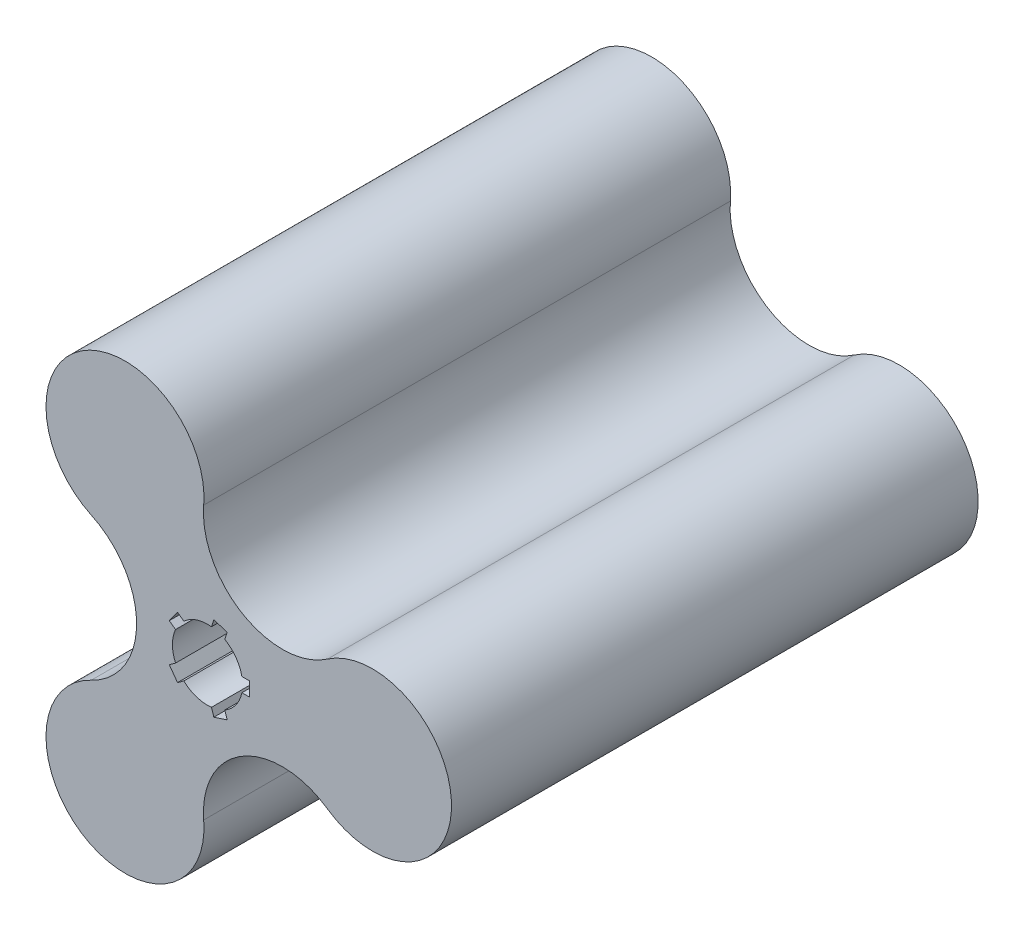
ISO-10303-21;
HEADER;
FILE_DESCRIPTION(('STEP AP214'),'2;1');
FILE_NAME('part.step','',(''),(''),'','','');
FILE_SCHEMA(('AUTOMOTIVE_DESIGN { 1 0 10303 214 1 1 1 1 }'));
ENDSEC;
DATA;
#1=APPLICATION_CONTEXT('core data for automotive mechanical design processes');
#2=APPLICATION_PROTOCOL_DEFINITION('international standard','automotive_design',2000,#1);
#3=PRODUCT_CONTEXT('',#1,'mechanical');
#4=PRODUCT('Part','Part','',(#3));
#5=PRODUCT_RELATED_PRODUCT_CATEGORY('part','',(#4));
#6=PRODUCT_DEFINITION_FORMATION('','',#4);
#7=PRODUCT_DEFINITION_CONTEXT('part definition',#1,'design');
#8=PRODUCT_DEFINITION('design','',#6,#7);
#9=PRODUCT_DEFINITION_SHAPE('','',#8);
#10=(LENGTH_UNIT() NAMED_UNIT(*) SI_UNIT(.MILLI.,.METRE.));
#11=(NAMED_UNIT(*) PLANE_ANGLE_UNIT() SI_UNIT($,.RADIAN.));
#12=(NAMED_UNIT(*) SI_UNIT($,.STERADIAN.) SOLID_ANGLE_UNIT());
#13=UNCERTAINTY_MEASURE_WITH_UNIT(LENGTH_MEASURE(1.E-05),#10,'distance_accuracy_value','');
#14=(GEOMETRIC_REPRESENTATION_CONTEXT(3) GLOBAL_UNCERTAINTY_ASSIGNED_CONTEXT((#13)) GLOBAL_UNIT_ASSIGNED_CONTEXT((#10,
#11,#12)) REPRESENTATION_CONTEXT('',''));
#15=CARTESIAN_POINT('',(0.,0.,0.));
#16=DIRECTION('',(0.,0.,1.));
#17=DIRECTION('',(1.,0.,0.));
#18=AXIS2_PLACEMENT_3D('',#15,#16,#17);
#19=CARTESIAN_POINT('',(21.3449205311974,-36.9704868435547,-150.));
#20=DIRECTION('',(0.,0.,1.));
#21=DIRECTION('',(1.,0.,0.));
#22=AXIS2_PLACEMENT_3D('',#19,#20,#21);
#23=CYLINDRICAL_SURFACE('',#22,22.5);
#24=CARTESIAN_POINT('',(21.3449205311974,-36.9704868435547,0.));
#25=DIRECTION('',(0.,0.,-1.));
#26=DIRECTION('',(1.,0.,0.));
#27=AXIS2_PLACEMENT_3D('',#24,#25,#26);
#28=CIRCLE('',#27,22.5);
#29=CARTESIAN_POINT('',(-1.07753973440139,-38.8368404107116,0.));
#30=VERTEX_POINT('',#29);
#31=CARTESIAN_POINT('',(34.1724602655988,-18.4852434217773,0.));
#32=VERTEX_POINT('',#31);
#33=EDGE_CURVE('E388',#30,#32,#28,.T.);
#34=ORIENTED_EDGE('',*,*,#33,.F.);
#35=DIRECTION('',(0.,0.,1.));
#36=VECTOR('',#35,1.);
#37=CARTESIAN_POINT('',(-1.07753973440139,-38.8368404107116,-150.));
#38=LINE('',#37,#36);
#39=CARTESIAN_POINT('',(-1.07753973440139,-38.8368404107116,-150.));
#40=VERTEX_POINT('',#39);
#41=EDGE_CURVE('E11',#40,#30,#38,.T.);
#42=ORIENTED_EDGE('',*,*,#41,.F.);
#43=CARTESIAN_POINT('',(21.3449205311974,-36.9704868435547,-150.));
#44=DIRECTION('',(0.,0.,-1.));
#45=DIRECTION('',(1.,0.,0.));
#46=AXIS2_PLACEMENT_3D('',#43,#44,#45);
#47=CIRCLE('',#46,22.5);
#48=CARTESIAN_POINT('',(34.1724602655988,-18.4852434217773,-150.));
#49=VERTEX_POINT('',#48);
#50=EDGE_CURVE('E442',#40,#49,#47,.T.);
#51=ORIENTED_EDGE('',*,*,#50,.T.);
#52=DIRECTION('',(0.,0.,1.));
#53=VECTOR('',#52,1.);
#54=CARTESIAN_POINT('',(34.1724602655988,-18.4852434217773,-150.));
#55=LINE('',#54,#53);
#56=EDGE_CURVE('E46',#49,#32,#55,.T.);
#57=ORIENTED_EDGE('',*,*,#56,.T.);
#58=EDGE_LOOP('',(#34,#42,#51,#57));
#59=FACE_BOUND('',#58,.T.);
#60=ADVANCED_FACE('F43',(#59),#23,.F.);
#61=CARTESIAN_POINT('',(-23.5000000000002,-40.7031939778685,-150.));
#62=DIRECTION('',(0.,0.,1.));
#63=DIRECTION('',(1.,0.,0.));
#64=AXIS2_PLACEMENT_3D('',#61,#62,#63);
#65=CYLINDRICAL_SURFACE('',#64,22.4999999999999);
#66=CARTESIAN_POINT('',(-23.5000000000002,-40.7031939778685,0.));
#67=DIRECTION('',(0.,0.,1.));
#68=DIRECTION('',(1.,0.,0.));
#69=AXIS2_PLACEMENT_3D('',#66,#67,#68);
#70=CIRCLE('',#69,22.4999999999999);
#71=CARTESIAN_POINT('',(-33.0949205311978,-20.3515969889343,0.));
#72=VERTEX_POINT('',#71);
#73=EDGE_CURVE('E447',#72,#30,#70,.T.);
#74=ORIENTED_EDGE('',*,*,#73,.F.);
#75=DIRECTION('',(0.,0.,1.));
#76=VECTOR('',#75,1.);
#77=CARTESIAN_POINT('',(-33.0949205311978,-20.3515969889343,-150.));
#78=LINE('',#77,#76);
#79=CARTESIAN_POINT('',(-33.0949205311978,-20.3515969889343,-150.));
#80=VERTEX_POINT('',#79);
#81=EDGE_CURVE('E52',#80,#72,#78,.T.);
#82=ORIENTED_EDGE('',*,*,#81,.F.);
#83=CARTESIAN_POINT('',(-23.5000000000002,-40.7031939778685,-150.));
#84=DIRECTION('',(0.,0.,1.));
#85=DIRECTION('',(1.,0.,0.));
#86=AXIS2_PLACEMENT_3D('',#83,#84,#85);
#87=CIRCLE('',#86,22.4999999999999);
#88=EDGE_CURVE('E463',#80,#40,#87,.T.);
#89=ORIENTED_EDGE('',*,*,#88,.T.);
#90=ORIENTED_EDGE('',*,*,#41,.T.);
#91=EDGE_LOOP('',(#74,#82,#89,#90));
#92=FACE_BOUND('',#91,.T.);
#93=ADVANCED_FACE('F512',(#92),#65,.T.);
#94=CARTESIAN_POINT('',(-42.6898410623955,0.,-150.));
#95=DIRECTION('',(0.,0.,1.));
#96=DIRECTION('',(1.,0.,0.));
#97=AXIS2_PLACEMENT_3D('',#94,#95,#96);
#98=CYLINDRICAL_SURFACE('',#97,22.5);
#99=CARTESIAN_POINT('',(-42.6898410623955,0.,0.));
#100=DIRECTION('',(0.,0.,-1.));
#101=DIRECTION('',(1.,0.,0.));
#102=AXIS2_PLACEMENT_3D('',#99,#100,#101);
#103=CIRCLE('',#102,22.5);
#104=CARTESIAN_POINT('',(-33.0949205311976,20.3515969889343,0.));
#105=VERTEX_POINT('',#104);
#106=EDGE_CURVE('E482',#105,#72,#103,.T.);
#107=ORIENTED_EDGE('',*,*,#106,.F.);
#108=DIRECTION('',(0.,0.,1.));
#109=VECTOR('',#108,1.);
#110=CARTESIAN_POINT('',(-33.0949205311976,20.3515969889343,-150.));
#111=LINE('',#110,#109);
#112=CARTESIAN_POINT('',(-33.0949205311976,20.3515969889343,-150.));
#113=VERTEX_POINT('',#112);
#114=EDGE_CURVE('E491',#113,#105,#111,.T.);
#115=ORIENTED_EDGE('',*,*,#114,.F.);
#116=CARTESIAN_POINT('',(-42.6898410623955,0.,-150.));
#117=DIRECTION('',(0.,0.,-1.));
#118=DIRECTION('',(1.,0.,0.));
#119=AXIS2_PLACEMENT_3D('',#116,#117,#118);
#120=CIRCLE('',#119,22.5);
#121=EDGE_CURVE('E459',#113,#80,#120,.T.);
#122=ORIENTED_EDGE('',*,*,#121,.T.);
#123=ORIENTED_EDGE('',*,*,#81,.T.);
#124=EDGE_LOOP('',(#107,#115,#122,#123));
#125=FACE_BOUND('',#124,.T.);
#126=ADVANCED_FACE('F523',(#125),#98,.F.);
#127=CARTESIAN_POINT('',(-23.4999999999996,40.7031939778688,-150.));
#128=DIRECTION('',(0.,0.,1.));
#129=DIRECTION('',(1.,0.,0.));
#130=AXIS2_PLACEMENT_3D('',#127,#128,#129);
#131=CYLINDRICAL_SURFACE('',#130,22.5000000000001);
#132=CARTESIAN_POINT('',(-23.4999999999996,40.7031939778688,0.));
#133=DIRECTION('',(0.,0.,1.));
#134=DIRECTION('',(1.,0.,0.));
#135=AXIS2_PLACEMENT_3D('',#132,#133,#134);
#136=CIRCLE('',#135,22.5000000000001);
#137=CARTESIAN_POINT('',(-1.07753973440072,38.8368404107116,0.));
#138=VERTEX_POINT('',#137);
#139=EDGE_CURVE('E478',#138,#105,#136,.T.);
#140=ORIENTED_EDGE('',*,*,#139,.F.);
#141=DIRECTION('',(0.,0.,1.));
#142=VECTOR('',#141,1.);
#143=CARTESIAN_POINT('',(-1.07753973440072,38.8368404107116,-150.));
#144=LINE('',#143,#142);
#145=CARTESIAN_POINT('',(-1.07753973440072,38.8368404107116,-150.));
#146=VERTEX_POINT('',#145);
#147=EDGE_CURVE('E494',#146,#138,#144,.T.);
#148=ORIENTED_EDGE('',*,*,#147,.F.);
#149=CARTESIAN_POINT('',(-23.4999999999996,40.7031939778688,-150.));
#150=DIRECTION('',(0.,0.,1.));
#151=DIRECTION('',(1.,0.,0.));
#152=AXIS2_PLACEMENT_3D('',#149,#150,#151);
#153=CIRCLE('',#152,22.5000000000001);
#154=EDGE_CURVE('E455',#146,#113,#153,.T.);
#155=ORIENTED_EDGE('',*,*,#154,.T.);
#156=ORIENTED_EDGE('',*,*,#114,.T.);
#157=EDGE_LOOP('',(#140,#148,#155,#156));
#158=FACE_BOUND('',#157,.T.);
#159=ADVANCED_FACE('F521',(#158),#131,.T.);
#160=CARTESIAN_POINT('',(21.3449205311979,36.9704868435545,-150.));
#161=DIRECTION('',(0.,0.,1.));
#162=DIRECTION('',(1.,0.,0.));
#163=AXIS2_PLACEMENT_3D('',#160,#161,#162);
#164=CYLINDRICAL_SURFACE('',#163,22.4999999999999);
#165=CARTESIAN_POINT('',(21.3449205311979,36.9704868435545,0.));
#166=DIRECTION('',(0.,0.,-1.));
#167=DIRECTION('',(1.,0.,0.));
#168=AXIS2_PLACEMENT_3D('',#165,#166,#167);
#169=CIRCLE('',#168,22.4999999999999);
#170=CARTESIAN_POINT('',(34.1724602655989,18.4852434217772,0.));
#171=VERTEX_POINT('',#170);
#172=EDGE_CURVE('E474',#171,#138,#169,.T.);
#173=ORIENTED_EDGE('',*,*,#172,.F.);
#174=DIRECTION('',(0.,0.,1.));
#175=VECTOR('',#174,1.);
#176=CARTESIAN_POINT('',(34.1724602655989,18.4852434217772,-150.));
#177=LINE('',#176,#175);
#178=CARTESIAN_POINT('',(34.1724602655989,18.4852434217772,-150.));
#179=VERTEX_POINT('',#178);
#180=EDGE_CURVE('E496',#179,#171,#177,.T.);
#181=ORIENTED_EDGE('',*,*,#180,.F.);
#182=CARTESIAN_POINT('',(21.3449205311979,36.9704868435545,-150.));
#183=DIRECTION('',(0.,0.,-1.));
#184=DIRECTION('',(1.,0.,0.));
#185=AXIS2_PLACEMENT_3D('',#182,#183,#184);
#186=CIRCLE('',#185,22.4999999999999);
#187=EDGE_CURVE('E451',#179,#146,#186,.T.);
#188=ORIENTED_EDGE('',*,*,#187,.T.);
#189=ORIENTED_EDGE('',*,*,#147,.T.);
#190=EDGE_LOOP('',(#173,#181,#188,#189));
#191=FACE_BOUND('',#190,.T.);
#192=ADVANCED_FACE('F518',(#191),#164,.F.);
#193=CARTESIAN_POINT('',(47.,0.,-150.));
#194=DIRECTION('',(0.,0.,1.));
#195=DIRECTION('',(1.,0.,0.));
#196=AXIS2_PLACEMENT_3D('',#193,#194,#195);
#197=CYLINDRICAL_SURFACE('',#196,22.5);
#198=CARTESIAN_POINT('',(47.,0.,0.));
#199=DIRECTION('',(0.,0.,1.));
#200=DIRECTION('',(1.,0.,0.));
#201=AXIS2_PLACEMENT_3D('',#198,#199,#200);
#202=CIRCLE('',#201,22.5);
#203=EDGE_CURVE('E470',#32,#171,#202,.T.);
#204=ORIENTED_EDGE('',*,*,#203,.F.);
#205=ORIENTED_EDGE('',*,*,#56,.F.);
#206=CARTESIAN_POINT('',(47.,0.,-150.));
#207=DIRECTION('',(0.,0.,1.));
#208=DIRECTION('',(1.,0.,0.));
#209=AXIS2_PLACEMENT_3D('',#206,#207,#208);
#210=CIRCLE('',#209,22.5);
#211=EDGE_CURVE('E446',#49,#179,#210,.T.);
#212=ORIENTED_EDGE('',*,*,#211,.T.);
#213=ORIENTED_EDGE('',*,*,#180,.T.);
#214=EDGE_LOOP('',(#204,#205,#212,#213));
#215=FACE_BOUND('',#214,.T.);
#216=ADVANCED_FACE('F506',(#215),#197,.T.);
#217=CARTESIAN_POINT('',(-1.07753973440139,-38.8368404107116,-150.));
#218=DIRECTION('',(0.,0.,1.));
#219=DIRECTION('',(1.,0.,0.));
#220=AXIS2_PLACEMENT_3D('',#217,#218,#219);
#221=PLANE('',#220);
#222=DIRECTION('',(0.809016994374947,-0.587785252292473,0.));
#223=VECTOR('',#222,1.);
#224=CARTESIAN_POINT('',(-9.10228582241995,4.1410617970483,-150.));
#225=LINE('',#224,#223);
#226=CARTESIAN_POINT('',(-10.8837744370843,5.43538903875934,-150.));
#227=VERTEX_POINT('',#226);
#228=CARTESIAN_POINT('',(-9.10228582241995,4.1410617970483,-150.));
#229=VERTEX_POINT('',#228);
#230=EDGE_CURVE('E226',#227,#229,#225,.T.);
#231=ORIENTED_EDGE('',*,*,#230,.T.);
#232=CARTESIAN_POINT('',(0.,0.,-150.));
#233=DIRECTION('',(0.,0.,1.));
#234=DIRECTION('',(1.,0.,0.));
#235=AXIS2_PLACEMENT_3D('',#232,#233,#234);
#236=CIRCLE('',#235,10.);
#237=CARTESIAN_POINT('',(-9.1022858224196,-4.14106179704906,-150.));
#238=VERTEX_POINT('',#237);
#239=EDGE_CURVE('E219',#229,#238,#236,.T.);
#240=ORIENTED_EDGE('',*,*,#239,.T.);
#241=DIRECTION('',(-0.809016994374947,-0.587785252292473,0.));
#242=VECTOR('',#241,1.);
#243=CARTESIAN_POINT('',(-9.1022858224196,-4.14106179704906,-150.));
#244=LINE('',#243,#242);
#245=CARTESIAN_POINT('',(-10.8837744370841,-5.43538903876017,-150.));
#246=VERTEX_POINT('',#245);
#247=EDGE_CURVE('E229',#238,#246,#244,.T.);
#248=ORIENTED_EDGE('',*,*,#247,.T.);
#249=DIRECTION('',(0.587785252292473,-0.809016994374948,0.));
#250=VECTOR('',#249,1.);
#251=CARTESIAN_POINT('',(-8.53263342791418,-8.67145701625995,-150.));
#252=LINE('',#251,#250);
#253=CARTESIAN_POINT('',(-8.53263342791418,-8.67145701625995,-150.));
#254=VERTEX_POINT('',#253);
#255=EDGE_CURVE('E60',#246,#254,#252,.T.);
#256=ORIENTED_EDGE('',*,*,#255,.T.);
#257=DIRECTION('',(0.809016994374947,0.587785252292474,0.));
#258=VECTOR('',#257,1.);
#259=CARTESIAN_POINT('',(-6.75114481324956,-7.37712977454875,-150.));
#260=LINE('',#259,#258);
#261=CARTESIAN_POINT('',(-6.75114481324956,-7.37712977454875,-150.));
#262=VERTEX_POINT('',#261);
#263=EDGE_CURVE('E248',#254,#262,#260,.T.);
#264=ORIENTED_EDGE('',*,*,#263,.T.);
#265=CARTESIAN_POINT('',(0.,0.,-150.));
#266=DIRECTION('',(0.,0.,1.));
#267=DIRECTION('',(1.,0.,0.));
#268=AXIS2_PLACEMENT_3D('',#265,#266,#267);
#269=CIRCLE('',#268,10.);
#270=CARTESIAN_POINT('',(1.12562279967839,-9.9364467146382,-150.));
#271=VERTEX_POINT('',#270);
#272=EDGE_CURVE('E252',#262,#271,#269,.T.);
#273=ORIENTED_EDGE('',*,*,#272,.T.);
#274=DIRECTION('',(0.309016994374948,-0.951056516295153,0.));
#275=VECTOR('',#274,1.);
#276=CARTESIAN_POINT('',(1.12562279967839,-9.9364467146382,-150.));
#277=LINE('',#276,#275);
#278=CARTESIAN_POINT('',(1.80609089990932,-12.0307121842918,-150.));
#279=VERTEX_POINT('',#278);
#280=EDGE_CURVE('E256',#271,#279,#277,.T.);
#281=ORIENTED_EDGE('',*,*,#280,.T.);
#282=DIRECTION('',(0.951056516295154,0.309016994374947,0.));
#283=VECTOR('',#282,1.);
#284=CARTESIAN_POINT('',(5.61031696508993,-10.7946442067921,-150.));
#285=LINE('',#284,#283);
#286=CARTESIAN_POINT('',(5.61031696508993,-10.7946442067921,-150.));
#287=VERTEX_POINT('',#286);
#288=EDGE_CURVE('E260',#279,#287,#285,.T.);
#289=ORIENTED_EDGE('',*,*,#288,.T.);
#290=DIRECTION('',(-0.309016994374947,0.951056516295154,0.));
#291=VECTOR('',#290,1.);
#292=CARTESIAN_POINT('',(4.92984886485898,-8.70037873713832,-150.));
#293=LINE('',#292,#291);
#294=CARTESIAN_POINT('',(4.92984886485898,-8.70037873713832,-150.));
#295=VERTEX_POINT('',#294);
#296=EDGE_CURVE('E264',#287,#295,#293,.T.);
#297=ORIENTED_EDGE('',*,*,#296,.T.);
#298=CARTESIAN_POINT('',(0.,0.,-150.));
#299=DIRECTION('',(0.,0.,1.));
#300=DIRECTION('',(1.,0.,0.));
#301=AXIS2_PLACEMENT_3D('',#298,#299,#300);
#302=CIRCLE('',#301,10.);
#303=CARTESIAN_POINT('',(9.79795897113271,-2.,-150.));
#304=VERTEX_POINT('',#303);
#305=EDGE_CURVE('E268',#295,#304,#302,.T.);
#306=ORIENTED_EDGE('',*,*,#305,.T.);
#307=DIRECTION('',(1.,0.,0.));
#308=VECTOR('',#307,1.);
#309=CARTESIAN_POINT('',(9.79795897113272,-2.,-150.));
#310=LINE('',#309,#308);
#311=CARTESIAN_POINT('',(12.,-2.,-150.));
#312=VERTEX_POINT('',#311);
#313=EDGE_CURVE('E272',#304,#312,#310,.T.);
#314=ORIENTED_EDGE('',*,*,#313,.T.);
#315=DIRECTION('',(0.,1.,0.));
#316=VECTOR('',#315,1.);
#317=CARTESIAN_POINT('',(12.,2.,-150.));
#318=LINE('',#317,#316);
#319=CARTESIAN_POINT('',(12.,2.,-150.));
#320=VERTEX_POINT('',#319);
#321=EDGE_CURVE('E276',#312,#320,#318,.T.);
#322=ORIENTED_EDGE('',*,*,#321,.T.);
#323=DIRECTION('',(-1.,0.,0.));
#324=VECTOR('',#323,1.);
#325=CARTESIAN_POINT('',(9.79795897113271,2.,-150.));
#326=LINE('',#325,#324);
#327=CARTESIAN_POINT('',(9.79795897113271,2.,-150.));
#328=VERTEX_POINT('',#327);
#329=EDGE_CURVE('E280',#320,#328,#326,.T.);
#330=ORIENTED_EDGE('',*,*,#329,.T.);
#331=CARTESIAN_POINT('',(0.,0.,-150.));
#332=DIRECTION('',(0.,0.,1.));
#333=DIRECTION('',(1.,0.,0.));
#334=AXIS2_PLACEMENT_3D('',#331,#332,#333);
#335=CIRCLE('',#334,10.);
#336=CARTESIAN_POINT('',(4.9298488648587,8.70037873713848,-150.));
#337=VERTEX_POINT('',#336);
#338=EDGE_CURVE('E284',#328,#337,#335,.T.);
#339=ORIENTED_EDGE('',*,*,#338,.T.);
#340=DIRECTION('',(0.309016994374948,0.951056516295154,0.));
#341=VECTOR('',#340,1.);
#342=CARTESIAN_POINT('',(4.9298488648587,8.70037873713848,-150.));
#343=LINE('',#342,#341);
#344=CARTESIAN_POINT('',(5.6103169650895,10.7946442067917,-150.));
#345=VERTEX_POINT('',#344);
#346=EDGE_CURVE('E288',#337,#345,#343,.T.);
#347=ORIENTED_EDGE('',*,*,#346,.T.);
#348=DIRECTION('',(-0.951056516295154,0.309016994374947,0.));
#349=VECTOR('',#348,1.);
#350=CARTESIAN_POINT('',(1.80609089990888,12.0307121842915,-150.));
#351=LINE('',#350,#349);
#352=CARTESIAN_POINT('',(1.80609089990888,12.0307121842915,-150.));
#353=VERTEX_POINT('',#352);
#354=EDGE_CURVE('E292',#345,#353,#351,.T.);
#355=ORIENTED_EDGE('',*,*,#354,.T.);
#356=DIRECTION('',(-0.309016994374947,-0.951056516295154,0.));
#357=VECTOR('',#356,1.);
#358=CARTESIAN_POINT('',(1.12562279967807,9.93644671463823,-150.));
#359=LINE('',#358,#357);
#360=CARTESIAN_POINT('',(1.12562279967807,9.93644671463823,-150.));
#361=VERTEX_POINT('',#360);
#362=EDGE_CURVE('E296',#353,#361,#359,.T.);
#363=ORIENTED_EDGE('',*,*,#362,.T.);
#364=CARTESIAN_POINT('',(0.,0.,-150.));
#365=DIRECTION('',(0.,0.,1.));
#366=DIRECTION('',(1.,0.,0.));
#367=AXIS2_PLACEMENT_3D('',#364,#365,#366);
#368=CIRCLE('',#367,10.);
#369=CARTESIAN_POINT('',(-6.75114481325018,7.37712977454818,-150.));
#370=VERTEX_POINT('',#369);
#371=EDGE_CURVE('E300',#361,#370,#368,.T.);
#372=ORIENTED_EDGE('',*,*,#371,.T.);
#373=DIRECTION('',(-0.809016994374947,0.587785252292473,0.));
#374=VECTOR('',#373,1.);
#375=CARTESIAN_POINT('',(-6.75114481325018,7.37712977454818,-150.));
#376=LINE('',#375,#374);
#377=CARTESIAN_POINT('',(-8.53263342791445,8.67145701625913,-150.));
#378=VERTEX_POINT('',#377);
#379=EDGE_CURVE('E304',#370,#378,#376,.T.);
#380=ORIENTED_EDGE('',*,*,#379,.T.);
#381=DIRECTION('',(-0.587785252292473,-0.809016994374948,0.));
#382=VECTOR('',#381,1.);
#383=CARTESIAN_POINT('',(-10.8837744370843,5.43538903875934,-150.));
#384=LINE('',#383,#382);
#385=EDGE_CURVE('E308',#378,#227,#384,.T.);
#386=ORIENTED_EDGE('',*,*,#385,.T.);
#387=EDGE_LOOP('',(#231,#240,#248,#256,#264,#273,#281,#289,#297,#306,#314,#322,#330,#339,#347,
#355,#363,#372,#380,#386));
#388=FACE_BOUND('',#387,.T.);
#389=ORIENTED_EDGE('',*,*,#50,.F.);
#390=ORIENTED_EDGE('',*,*,#88,.F.);
#391=ORIENTED_EDGE('',*,*,#121,.F.);
#392=ORIENTED_EDGE('',*,*,#154,.F.);
#393=ORIENTED_EDGE('',*,*,#187,.F.);
#394=ORIENTED_EDGE('',*,*,#211,.F.);
#395=EDGE_LOOP('',(#389,#390,#391,#392,#393,#394));
#396=FACE_BOUND('',#395,.T.);
#397=ADVANCED_FACE('F234',(#388,#396),#221,.F.);
#398=CARTESIAN_POINT('',(-1.07753973440139,-38.8368404107116,0.));
#399=DIRECTION('',(0.,0.,1.));
#400=DIRECTION('',(1.,0.,0.));
#401=AXIS2_PLACEMENT_3D('',#398,#399,#400);
#402=PLANE('',#401);
#403=CARTESIAN_POINT('',(0.,0.,0.));
#404=DIRECTION('',(0.,0.,1.));
#405=DIRECTION('',(1.,0.,0.));
#406=AXIS2_PLACEMENT_3D('',#403,#404,#405);
#407=CIRCLE('',#406,10.);
#408=CARTESIAN_POINT('',(-9.10228582241995,4.1410617970483,0.));
#409=VERTEX_POINT('',#408);
#410=CARTESIAN_POINT('',(-9.1022858224196,-4.14106179704907,0.));
#411=VERTEX_POINT('',#410);
#412=EDGE_CURVE('E68',#409,#411,#407,.T.);
#413=ORIENTED_EDGE('',*,*,#412,.F.);
#414=DIRECTION('',(0.809016994374947,-0.587785252292473,0.));
#415=VECTOR('',#414,1.);
#416=CARTESIAN_POINT('',(-9.10228582241995,4.1410617970483,0.));
#417=LINE('',#416,#415);
#418=CARTESIAN_POINT('',(-10.8837744370843,5.43538903875934,0.));
#419=VERTEX_POINT('',#418);
#420=EDGE_CURVE('E239',#419,#409,#417,.T.);
#421=ORIENTED_EDGE('',*,*,#420,.F.);
#422=DIRECTION('',(-0.587785252292473,-0.809016994374948,0.));
#423=VECTOR('',#422,1.);
#424=CARTESIAN_POINT('',(-10.8837744370843,5.43538903875934,0.));
#425=LINE('',#424,#423);
#426=CARTESIAN_POINT('',(-8.53263342791445,8.67145701625913,0.));
#427=VERTEX_POINT('',#426);
#428=EDGE_CURVE('E243',#427,#419,#425,.T.);
#429=ORIENTED_EDGE('',*,*,#428,.F.);
#430=DIRECTION('',(-0.809016994374947,0.587785252292473,0.));
#431=VECTOR('',#430,1.);
#432=CARTESIAN_POINT('',(-6.75114481325018,7.37712977454818,0.));
#433=LINE('',#432,#431);
#434=CARTESIAN_POINT('',(-6.75114481325018,7.37712977454818,0.));
#435=VERTEX_POINT('',#434);
#436=EDGE_CURVE('E378',#435,#427,#433,.T.);
#437=ORIENTED_EDGE('',*,*,#436,.F.);
#438=CARTESIAN_POINT('',(0.,0.,0.));
#439=DIRECTION('',(0.,0.,1.));
#440=DIRECTION('',(1.,0.,0.));
#441=AXIS2_PLACEMENT_3D('',#438,#439,#440);
#442=CIRCLE('',#441,10.);
#443=CARTESIAN_POINT('',(1.12562279967807,9.93644671463823,0.));
#444=VERTEX_POINT('',#443);
#445=EDGE_CURVE('E374',#444,#435,#442,.T.);
#446=ORIENTED_EDGE('',*,*,#445,.F.);
#447=DIRECTION('',(-0.309016994374947,-0.951056516295154,0.));
#448=VECTOR('',#447,1.);
#449=CARTESIAN_POINT('',(1.12562279967807,9.93644671463823,0.));
#450=LINE('',#449,#448);
#451=CARTESIAN_POINT('',(1.80609089990888,12.0307121842915,0.));
#452=VERTEX_POINT('',#451);
#453=EDGE_CURVE('E370',#452,#444,#450,.T.);
#454=ORIENTED_EDGE('',*,*,#453,.F.);
#455=DIRECTION('',(-0.951056516295154,0.309016994374947,0.));
#456=VECTOR('',#455,1.);
#457=CARTESIAN_POINT('',(1.80609089990888,12.0307121842915,0.));
#458=LINE('',#457,#456);
#459=CARTESIAN_POINT('',(5.6103169650895,10.7946442067917,0.));
#460=VERTEX_POINT('',#459);
#461=EDGE_CURVE('E366',#460,#452,#458,.T.);
#462=ORIENTED_EDGE('',*,*,#461,.F.);
#463=DIRECTION('',(0.309016994374948,0.951056516295154,0.));
#464=VECTOR('',#463,1.);
#465=CARTESIAN_POINT('',(4.9298488648587,8.70037873713848,0.));
#466=LINE('',#465,#464);
#467=CARTESIAN_POINT('',(4.9298488648587,8.70037873713848,0.));
#468=VERTEX_POINT('',#467);
#469=EDGE_CURVE('E362',#468,#460,#466,.T.);
#470=ORIENTED_EDGE('',*,*,#469,.F.);
#471=CARTESIAN_POINT('',(0.,0.,0.));
#472=DIRECTION('',(0.,0.,1.));
#473=DIRECTION('',(1.,0.,0.));
#474=AXIS2_PLACEMENT_3D('',#471,#472,#473);
#475=CIRCLE('',#474,10.);
#476=CARTESIAN_POINT('',(9.79795897113271,2.,0.));
#477=VERTEX_POINT('',#476);
#478=EDGE_CURVE('E358',#477,#468,#475,.T.);
#479=ORIENTED_EDGE('',*,*,#478,.F.);
#480=DIRECTION('',(-1.,0.,0.));
#481=VECTOR('',#480,1.);
#482=CARTESIAN_POINT('',(9.79795897113271,2.,0.));
#483=LINE('',#482,#481);
#484=CARTESIAN_POINT('',(12.,2.,0.));
#485=VERTEX_POINT('',#484);
#486=EDGE_CURVE('E354',#485,#477,#483,.T.);
#487=ORIENTED_EDGE('',*,*,#486,.F.);
#488=DIRECTION('',(0.,1.,0.));
#489=VECTOR('',#488,1.);
#490=CARTESIAN_POINT('',(12.,2.,0.));
#491=LINE('',#490,#489);
#492=CARTESIAN_POINT('',(12.,-2.,0.));
#493=VERTEX_POINT('',#492);
#494=EDGE_CURVE('E350',#493,#485,#491,.T.);
#495=ORIENTED_EDGE('',*,*,#494,.F.);
#496=DIRECTION('',(1.,0.,0.));
#497=VECTOR('',#496,1.);
#498=CARTESIAN_POINT('',(9.79795897113272,-2.,0.));
#499=LINE('',#498,#497);
#500=CARTESIAN_POINT('',(9.79795897113271,-2.,0.));
#501=VERTEX_POINT('',#500);
#502=EDGE_CURVE('E346',#501,#493,#499,.T.);
#503=ORIENTED_EDGE('',*,*,#502,.F.);
#504=CARTESIAN_POINT('',(0.,0.,0.));
#505=DIRECTION('',(0.,0.,1.));
#506=DIRECTION('',(1.,0.,0.));
#507=AXIS2_PLACEMENT_3D('',#504,#505,#506);
#508=CIRCLE('',#507,10.);
#509=CARTESIAN_POINT('',(4.92984886485898,-8.70037873713832,0.));
#510=VERTEX_POINT('',#509);
#511=EDGE_CURVE('E342',#510,#501,#508,.T.);
#512=ORIENTED_EDGE('',*,*,#511,.F.);
#513=DIRECTION('',(-0.309016994374947,0.951056516295154,0.));
#514=VECTOR('',#513,1.);
#515=CARTESIAN_POINT('',(4.92984886485898,-8.70037873713832,0.));
#516=LINE('',#515,#514);
#517=CARTESIAN_POINT('',(5.61031696508993,-10.7946442067921,0.));
#518=VERTEX_POINT('',#517);
#519=EDGE_CURVE('E338',#518,#510,#516,.T.);
#520=ORIENTED_EDGE('',*,*,#519,.F.);
#521=DIRECTION('',(0.951056516295154,0.309016994374947,0.));
#522=VECTOR('',#521,1.);
#523=CARTESIAN_POINT('',(5.61031696508993,-10.7946442067921,0.));
#524=LINE('',#523,#522);
#525=CARTESIAN_POINT('',(1.80609089990932,-12.0307121842918,0.));
#526=VERTEX_POINT('',#525);
#527=EDGE_CURVE('E334',#526,#518,#524,.T.);
#528=ORIENTED_EDGE('',*,*,#527,.F.);
#529=DIRECTION('',(0.309016994374948,-0.951056516295153,0.));
#530=VECTOR('',#529,1.);
#531=CARTESIAN_POINT('',(1.12562279967839,-9.9364467146382,0.));
#532=LINE('',#531,#530);
#533=CARTESIAN_POINT('',(1.12562279967839,-9.9364467146382,0.));
#534=VERTEX_POINT('',#533);
#535=EDGE_CURVE('E330',#534,#526,#532,.T.);
#536=ORIENTED_EDGE('',*,*,#535,.F.);
#537=CARTESIAN_POINT('',(0.,0.,0.));
#538=DIRECTION('',(0.,0.,1.));
#539=DIRECTION('',(1.,0.,0.));
#540=AXIS2_PLACEMENT_3D('',#537,#538,#539);
#541=CIRCLE('',#540,10.);
#542=CARTESIAN_POINT('',(-6.75114481324956,-7.37712977454875,0.));
#543=VERTEX_POINT('',#542);
#544=EDGE_CURVE('E326',#543,#534,#541,.T.);
#545=ORIENTED_EDGE('',*,*,#544,.F.);
#546=DIRECTION('',(0.809016994374947,0.587785252292474,0.));
#547=VECTOR('',#546,1.);
#548=CARTESIAN_POINT('',(-6.75114481324956,-7.37712977454875,0.));
#549=LINE('',#548,#547);
#550=CARTESIAN_POINT('',(-8.53263342791418,-8.67145701625995,0.));
#551=VERTEX_POINT('',#550);
#552=EDGE_CURVE('E322',#551,#543,#549,.T.);
#553=ORIENTED_EDGE('',*,*,#552,.F.);
#554=DIRECTION('',(0.587785252292473,-0.809016994374948,0.));
#555=VECTOR('',#554,1.);
#556=CARTESIAN_POINT('',(-8.53263342791418,-8.67145701625995,0.));
#557=LINE('',#556,#555);
#558=CARTESIAN_POINT('',(-10.8837744370841,-5.43538903876016,0.));
#559=VERTEX_POINT('',#558);
#560=EDGE_CURVE('E318',#559,#551,#557,.T.);
#561=ORIENTED_EDGE('',*,*,#560,.F.);
#562=DIRECTION('',(-0.809016994374947,-0.587785252292473,0.));
#563=VECTOR('',#562,1.);
#564=CARTESIAN_POINT('',(-9.1022858224196,-4.14106179704906,0.));
#565=LINE('',#564,#563);
#566=EDGE_CURVE('E315',#411,#559,#565,.T.);
#567=ORIENTED_EDGE('',*,*,#566,.F.);
#568=EDGE_LOOP('',(#413,#421,#429,#437,#446,#454,#462,#470,#479,#487,#495,#503,#512,#520,#528,
#536,#545,#553,#561,#567));
#569=FACE_BOUND('',#568,.T.);
#570=ORIENTED_EDGE('',*,*,#33,.T.);
#571=ORIENTED_EDGE('',*,*,#203,.T.);
#572=ORIENTED_EDGE('',*,*,#172,.T.);
#573=ORIENTED_EDGE('',*,*,#139,.T.);
#574=ORIENTED_EDGE('',*,*,#106,.T.);
#575=ORIENTED_EDGE('',*,*,#73,.T.);
#576=EDGE_LOOP('',(#570,#571,#572,#573,#574,#575));
#577=FACE_BOUND('',#576,.T.);
#578=ADVANCED_FACE('F508',(#569,#577),#402,.T.);
#579=CARTESIAN_POINT('',(0.,0.,-150.));
#580=DIRECTION('',(0.,0.,1.));
#581=DIRECTION('',(1.,0.,0.));
#582=AXIS2_PLACEMENT_3D('',#579,#580,#581);
#583=CYLINDRICAL_SURFACE('',#582,10.);
#584=ORIENTED_EDGE('',*,*,#412,.T.);
#585=DIRECTION('',(0.,0.,1.));
#586=VECTOR('',#585,1.);
#587=CARTESIAN_POINT('',(-9.1022858224196,-4.14106179704906,-150.));
#588=LINE('',#587,#586);
#589=EDGE_CURVE('E215',#238,#411,#588,.T.);
#590=ORIENTED_EDGE('',*,*,#589,.F.);
#591=ORIENTED_EDGE('',*,*,#239,.F.);
#592=DIRECTION('',(0.,0.,1.));
#593=VECTOR('',#592,1.);
#594=CARTESIAN_POINT('',(-9.10228582241995,4.1410617970483,-150.));
#595=LINE('',#594,#593);
#596=EDGE_CURVE('E385',#229,#409,#595,.T.);
#597=ORIENTED_EDGE('',*,*,#596,.T.);
#598=EDGE_LOOP('',(#584,#590,#591,#597));
#599=FACE_BOUND('',#598,.T.);
#600=ADVANCED_FACE('F217',(#599),#583,.F.);
#601=CARTESIAN_POINT('',(-9.10228582241995,4.1410617970483,-150.));
#602=DIRECTION('',(-0.587785252292473,-0.809016994374947,0.));
#603=DIRECTION('',(0.809016994374947,-0.587785252292473,0.));
#604=AXIS2_PLACEMENT_3D('',#601,#602,#603);
#605=PLANE('',#604);
#606=ORIENTED_EDGE('',*,*,#420,.T.);
#607=ORIENTED_EDGE('',*,*,#596,.F.);
#608=ORIENTED_EDGE('',*,*,#230,.F.);
#609=DIRECTION('',(0.,0.,1.));
#610=VECTOR('',#609,1.);
#611=CARTESIAN_POINT('',(-10.8837744370843,5.43538903875934,-150.));
#612=LINE('',#611,#610);
#613=EDGE_CURVE('E389',#227,#419,#612,.T.);
#614=ORIENTED_EDGE('',*,*,#613,.T.);
#615=EDGE_LOOP('',(#606,#607,#608,#614));
#616=FACE_BOUND('',#615,.T.);
#617=ADVANCED_FACE('F597',(#616),#605,.F.);
#618=CARTESIAN_POINT('',(-10.8837744370843,5.43538903875934,-150.));
#619=DIRECTION('',(-0.809016994374948,0.587785252292473,0.));
#620=DIRECTION('',(-0.587785252292473,-0.809016994374948,0.));
#621=AXIS2_PLACEMENT_3D('',#618,#619,#620);
#622=PLANE('',#621);
#623=ORIENTED_EDGE('',*,*,#428,.T.);
#624=ORIENTED_EDGE('',*,*,#613,.F.);
#625=ORIENTED_EDGE('',*,*,#385,.F.);
#626=DIRECTION('',(0.,0.,1.));
#627=VECTOR('',#626,1.);
#628=CARTESIAN_POINT('',(-8.53263342791445,8.67145701625913,-150.));
#629=LINE('',#628,#627);
#630=EDGE_CURVE('E392',#378,#427,#629,.T.);
#631=ORIENTED_EDGE('',*,*,#630,.T.);
#632=EDGE_LOOP('',(#623,#624,#625,#631));
#633=FACE_BOUND('',#632,.T.);
#634=ADVANCED_FACE('F607',(#633),#622,.F.);
#635=CARTESIAN_POINT('',(-6.75114481325018,7.37712977454818,-150.));
#636=DIRECTION('',(0.587785252292473,0.809016994374947,0.));
#637=DIRECTION('',(-0.809016994374947,0.587785252292473,0.));
#638=AXIS2_PLACEMENT_3D('',#635,#636,#637);
#639=PLANE('',#638);
#640=ORIENTED_EDGE('',*,*,#436,.T.);
#641=ORIENTED_EDGE('',*,*,#630,.F.);
#642=ORIENTED_EDGE('',*,*,#379,.F.);
#643=DIRECTION('',(0.,0.,1.));
#644=VECTOR('',#643,1.);
#645=CARTESIAN_POINT('',(-6.75114481325018,7.37712977454818,-150.));
#646=LINE('',#645,#644);
#647=EDGE_CURVE('E395',#370,#435,#646,.T.);
#648=ORIENTED_EDGE('',*,*,#647,.T.);
#649=EDGE_LOOP('',(#640,#641,#642,#648));
#650=FACE_BOUND('',#649,.T.);
#651=ADVANCED_FACE('F618',(#650),#639,.F.);
#652=CARTESIAN_POINT('',(0.,0.,-150.));
#653=DIRECTION('',(0.,0.,1.));
#654=DIRECTION('',(1.,0.,0.));
#655=AXIS2_PLACEMENT_3D('',#652,#653,#654);
#656=CYLINDRICAL_SURFACE('',#655,10.);
#657=ORIENTED_EDGE('',*,*,#445,.T.);
#658=ORIENTED_EDGE('',*,*,#647,.F.);
#659=ORIENTED_EDGE('',*,*,#371,.F.);
#660=DIRECTION('',(0.,0.,1.));
#661=VECTOR('',#660,1.);
#662=CARTESIAN_POINT('',(1.12562279967807,9.93644671463823,-150.));
#663=LINE('',#662,#661);
#664=EDGE_CURVE('E398',#361,#444,#663,.T.);
#665=ORIENTED_EDGE('',*,*,#664,.T.);
#666=EDGE_LOOP('',(#657,#658,#659,#665));
#667=FACE_BOUND('',#666,.T.);
#668=ADVANCED_FACE('F629',(#667),#656,.F.);
#669=CARTESIAN_POINT('',(1.12562279967807,9.93644671463823,-150.));
#670=DIRECTION('',(-0.951056516295154,0.309016994374947,0.));
#671=DIRECTION('',(-0.309016994374947,-0.951056516295154,0.));
#672=AXIS2_PLACEMENT_3D('',#669,#670,#671);
#673=PLANE('',#672);
#674=ORIENTED_EDGE('',*,*,#453,.T.);
#675=ORIENTED_EDGE('',*,*,#664,.F.);
#676=ORIENTED_EDGE('',*,*,#362,.F.);
#677=DIRECTION('',(0.,0.,1.));
#678=VECTOR('',#677,1.);
#679=CARTESIAN_POINT('',(1.80609089990888,12.0307121842915,-150.));
#680=LINE('',#679,#678);
#681=EDGE_CURVE('E401',#353,#452,#680,.T.);
#682=ORIENTED_EDGE('',*,*,#681,.T.);
#683=EDGE_LOOP('',(#674,#675,#676,#682));
#684=FACE_BOUND('',#683,.T.);
#685=ADVANCED_FACE('F640',(#684),#673,.F.);
#686=CARTESIAN_POINT('',(1.80609089990888,12.0307121842915,-150.));
#687=DIRECTION('',(0.309016994374947,0.951056516295154,0.));
#688=DIRECTION('',(-0.951056516295154,0.309016994374947,0.));
#689=AXIS2_PLACEMENT_3D('',#686,#687,#688);
#690=PLANE('',#689);
#691=ORIENTED_EDGE('',*,*,#461,.T.);
#692=ORIENTED_EDGE('',*,*,#681,.F.);
#693=ORIENTED_EDGE('',*,*,#354,.F.);
#694=DIRECTION('',(0.,0.,1.));
#695=VECTOR('',#694,1.);
#696=CARTESIAN_POINT('',(5.6103169650895,10.7946442067917,-150.));
#697=LINE('',#696,#695);
#698=EDGE_CURVE('E404',#345,#460,#697,.T.);
#699=ORIENTED_EDGE('',*,*,#698,.T.);
#700=EDGE_LOOP('',(#691,#692,#693,#699));
#701=FACE_BOUND('',#700,.T.);
#702=ADVANCED_FACE('F651',(#701),#690,.F.);
#703=CARTESIAN_POINT('',(4.9298488648587,8.70037873713848,-150.));
#704=DIRECTION('',(0.951056516295154,-0.309016994374948,0.));
#705=DIRECTION('',(0.309016994374948,0.951056516295154,0.));
#706=AXIS2_PLACEMENT_3D('',#703,#704,#705);
#707=PLANE('',#706);
#708=ORIENTED_EDGE('',*,*,#469,.T.);
#709=ORIENTED_EDGE('',*,*,#698,.F.);
#710=ORIENTED_EDGE('',*,*,#346,.F.);
#711=DIRECTION('',(0.,0.,1.));
#712=VECTOR('',#711,1.);
#713=CARTESIAN_POINT('',(4.9298488648587,8.70037873713848,-150.));
#714=LINE('',#713,#712);
#715=EDGE_CURVE('E407',#337,#468,#714,.T.);
#716=ORIENTED_EDGE('',*,*,#715,.T.);
#717=EDGE_LOOP('',(#708,#709,#710,#716));
#718=FACE_BOUND('',#717,.T.);
#719=ADVANCED_FACE('F662',(#718),#707,.F.);
#720=CARTESIAN_POINT('',(0.,0.,-150.));
#721=DIRECTION('',(0.,0.,1.));
#722=DIRECTION('',(1.,0.,0.));
#723=AXIS2_PLACEMENT_3D('',#720,#721,#722);
#724=CYLINDRICAL_SURFACE('',#723,10.);
#725=ORIENTED_EDGE('',*,*,#478,.T.);
#726=ORIENTED_EDGE('',*,*,#715,.F.);
#727=ORIENTED_EDGE('',*,*,#338,.F.);
#728=DIRECTION('',(0.,0.,1.));
#729=VECTOR('',#728,1.);
#730=CARTESIAN_POINT('',(9.79795897113271,2.,-150.));
#731=LINE('',#730,#729);
#732=EDGE_CURVE('E410',#328,#477,#731,.T.);
#733=ORIENTED_EDGE('',*,*,#732,.T.);
#734=EDGE_LOOP('',(#725,#726,#727,#733));
#735=FACE_BOUND('',#734,.T.);
#736=ADVANCED_FACE('F673',(#735),#724,.F.);
#737=CARTESIAN_POINT('',(9.79795897113271,2.,-150.));
#738=DIRECTION('',(0.,1.,0.));
#739=DIRECTION('',(0.,0.,1.));
#740=AXIS2_PLACEMENT_3D('',#737,#738,#739);
#741=PLANE('',#740);
#742=ORIENTED_EDGE('',*,*,#486,.T.);
#743=ORIENTED_EDGE('',*,*,#732,.F.);
#744=ORIENTED_EDGE('',*,*,#329,.F.);
#745=DIRECTION('',(0.,0.,1.));
#746=VECTOR('',#745,1.);
#747=CARTESIAN_POINT('',(12.,2.,-150.));
#748=LINE('',#747,#746);
#749=EDGE_CURVE('E413',#320,#485,#748,.T.);
#750=ORIENTED_EDGE('',*,*,#749,.T.);
#751=EDGE_LOOP('',(#742,#743,#744,#750));
#752=FACE_BOUND('',#751,.T.);
#753=ADVANCED_FACE('F684',(#752),#741,.F.);
#754=CARTESIAN_POINT('',(12.,2.,-150.));
#755=DIRECTION('',(1.,0.,0.));
#756=DIRECTION('',(0.,0.,-1.));
#757=AXIS2_PLACEMENT_3D('',#754,#755,#756);
#758=PLANE('',#757);
#759=ORIENTED_EDGE('',*,*,#494,.T.);
#760=ORIENTED_EDGE('',*,*,#749,.F.);
#761=ORIENTED_EDGE('',*,*,#321,.F.);
#762=DIRECTION('',(0.,0.,1.));
#763=VECTOR('',#762,1.);
#764=CARTESIAN_POINT('',(12.,-2.,-150.));
#765=LINE('',#764,#763);
#766=EDGE_CURVE('E416',#312,#493,#765,.T.);
#767=ORIENTED_EDGE('',*,*,#766,.T.);
#768=EDGE_LOOP('',(#759,#760,#761,#767));
#769=FACE_BOUND('',#768,.T.);
#770=ADVANCED_FACE('F695',(#769),#758,.F.);
#771=CARTESIAN_POINT('',(9.79795897113272,-2.,-150.));
#772=DIRECTION('',(0.,-1.,0.));
#773=DIRECTION('',(0.,0.,-1.));
#774=AXIS2_PLACEMENT_3D('',#771,#772,#773);
#775=PLANE('',#774);
#776=ORIENTED_EDGE('',*,*,#502,.T.);
#777=ORIENTED_EDGE('',*,*,#766,.F.);
#778=ORIENTED_EDGE('',*,*,#313,.F.);
#779=DIRECTION('',(0.,0.,1.));
#780=VECTOR('',#779,1.);
#781=CARTESIAN_POINT('',(9.79795897113271,-2.,-150.));
#782=LINE('',#781,#780);
#783=EDGE_CURVE('E419',#304,#501,#782,.T.);
#784=ORIENTED_EDGE('',*,*,#783,.T.);
#785=EDGE_LOOP('',(#776,#777,#778,#784));
#786=FACE_BOUND('',#785,.T.);
#787=ADVANCED_FACE('F706',(#786),#775,.F.);
#788=CARTESIAN_POINT('',(0.,0.,-150.));
#789=DIRECTION('',(0.,0.,1.));
#790=DIRECTION('',(1.,0.,0.));
#791=AXIS2_PLACEMENT_3D('',#788,#789,#790);
#792=CYLINDRICAL_SURFACE('',#791,10.);
#793=ORIENTED_EDGE('',*,*,#511,.T.);
#794=ORIENTED_EDGE('',*,*,#783,.F.);
#795=ORIENTED_EDGE('',*,*,#305,.F.);
#796=DIRECTION('',(0.,0.,1.));
#797=VECTOR('',#796,1.);
#798=CARTESIAN_POINT('',(4.92984886485898,-8.70037873713832,-150.));
#799=LINE('',#798,#797);
#800=EDGE_CURVE('E422',#295,#510,#799,.T.);
#801=ORIENTED_EDGE('',*,*,#800,.T.);
#802=EDGE_LOOP('',(#793,#794,#795,#801));
#803=FACE_BOUND('',#802,.T.);
#804=ADVANCED_FACE('F717',(#803),#792,.F.);
#805=CARTESIAN_POINT('',(4.92984886485898,-8.70037873713832,-150.));
#806=DIRECTION('',(0.951056516295154,0.309016994374947,0.));
#807=DIRECTION('',(-0.309016994374947,0.951056516295154,0.));
#808=AXIS2_PLACEMENT_3D('',#805,#806,#807);
#809=PLANE('',#808);
#810=ORIENTED_EDGE('',*,*,#519,.T.);
#811=ORIENTED_EDGE('',*,*,#800,.F.);
#812=ORIENTED_EDGE('',*,*,#296,.F.);
#813=DIRECTION('',(0.,0.,1.));
#814=VECTOR('',#813,1.);
#815=CARTESIAN_POINT('',(5.61031696508993,-10.7946442067921,-150.));
#816=LINE('',#815,#814);
#817=EDGE_CURVE('E425',#287,#518,#816,.T.);
#818=ORIENTED_EDGE('',*,*,#817,.T.);
#819=EDGE_LOOP('',(#810,#811,#812,#818));
#820=FACE_BOUND('',#819,.T.);
#821=ADVANCED_FACE('F728',(#820),#809,.F.);
#822=CARTESIAN_POINT('',(5.61031696508993,-10.7946442067921,-150.));
#823=DIRECTION('',(0.309016994374947,-0.951056516295153,0.));
#824=DIRECTION('',(0.951056516295154,0.309016994374948,0.));
#825=AXIS2_PLACEMENT_3D('',#822,#823,#824);
#826=PLANE('',#825);
#827=ORIENTED_EDGE('',*,*,#527,.T.);
#828=ORIENTED_EDGE('',*,*,#817,.F.);
#829=ORIENTED_EDGE('',*,*,#288,.F.);
#830=DIRECTION('',(0.,0.,1.));
#831=VECTOR('',#830,1.);
#832=CARTESIAN_POINT('',(1.80609089990932,-12.0307121842918,-150.));
#833=LINE('',#832,#831);
#834=EDGE_CURVE('E428',#279,#526,#833,.T.);
#835=ORIENTED_EDGE('',*,*,#834,.T.);
#836=EDGE_LOOP('',(#827,#828,#829,#835));
#837=FACE_BOUND('',#836,.T.);
#838=ADVANCED_FACE('F739',(#837),#826,.F.);
#839=CARTESIAN_POINT('',(1.12562279967839,-9.9364467146382,-150.));
#840=DIRECTION('',(-0.951056516295153,-0.309016994374948,0.));
#841=DIRECTION('',(0.309016994374948,-0.951056516295154,0.));
#842=AXIS2_PLACEMENT_3D('',#839,#840,#841);
#843=PLANE('',#842);
#844=ORIENTED_EDGE('',*,*,#535,.T.);
#845=ORIENTED_EDGE('',*,*,#834,.F.);
#846=ORIENTED_EDGE('',*,*,#280,.F.);
#847=DIRECTION('',(0.,0.,1.));
#848=VECTOR('',#847,1.);
#849=CARTESIAN_POINT('',(1.12562279967839,-9.9364467146382,-150.));
#850=LINE('',#849,#848);
#851=EDGE_CURVE('E431',#271,#534,#850,.T.);
#852=ORIENTED_EDGE('',*,*,#851,.T.);
#853=EDGE_LOOP('',(#844,#845,#846,#852));
#854=FACE_BOUND('',#853,.T.);
#855=ADVANCED_FACE('F750',(#854),#843,.F.);
#856=CARTESIAN_POINT('',(0.,0.,-150.));
#857=DIRECTION('',(0.,0.,1.));
#858=DIRECTION('',(1.,0.,0.));
#859=AXIS2_PLACEMENT_3D('',#856,#857,#858);
#860=CYLINDRICAL_SURFACE('',#859,10.);
#861=ORIENTED_EDGE('',*,*,#544,.T.);
#862=ORIENTED_EDGE('',*,*,#851,.F.);
#863=ORIENTED_EDGE('',*,*,#272,.F.);
#864=DIRECTION('',(0.,0.,1.));
#865=VECTOR('',#864,1.);
#866=CARTESIAN_POINT('',(-6.75114481324956,-7.37712977454875,-150.));
#867=LINE('',#866,#865);
#868=EDGE_CURVE('E434',#262,#543,#867,.T.);
#869=ORIENTED_EDGE('',*,*,#868,.T.);
#870=EDGE_LOOP('',(#861,#862,#863,#869));
#871=FACE_BOUND('',#870,.T.);
#872=ADVANCED_FACE('F761',(#871),#860,.F.);
#873=CARTESIAN_POINT('',(-6.75114481324956,-7.37712977454875,-150.));
#874=DIRECTION('',(0.587785252292474,-0.809016994374947,0.));
#875=DIRECTION('',(0.809016994374947,0.587785252292474,0.));
#876=AXIS2_PLACEMENT_3D('',#873,#874,#875);
#877=PLANE('',#876);
#878=ORIENTED_EDGE('',*,*,#552,.T.);
#879=ORIENTED_EDGE('',*,*,#868,.F.);
#880=ORIENTED_EDGE('',*,*,#263,.F.);
#881=DIRECTION('',(0.,0.,1.));
#882=VECTOR('',#881,1.);
#883=CARTESIAN_POINT('',(-8.53263342791418,-8.67145701625995,-150.));
#884=LINE('',#883,#882);
#885=EDGE_CURVE('E437',#254,#551,#884,.T.);
#886=ORIENTED_EDGE('',*,*,#885,.T.);
#887=EDGE_LOOP('',(#878,#879,#880,#886));
#888=FACE_BOUND('',#887,.T.);
#889=ADVANCED_FACE('F772',(#888),#877,.F.);
#890=CARTESIAN_POINT('',(-8.53263342791418,-8.67145701625995,-150.));
#891=DIRECTION('',(-0.809016994374948,-0.587785252292473,0.));
#892=DIRECTION('',(0.587785252292473,-0.809016994374948,0.));
#893=AXIS2_PLACEMENT_3D('',#890,#891,#892);
#894=PLANE('',#893);
#895=ORIENTED_EDGE('',*,*,#560,.T.);
#896=ORIENTED_EDGE('',*,*,#885,.F.);
#897=ORIENTED_EDGE('',*,*,#255,.F.);
#898=DIRECTION('',(0.,0.,1.));
#899=VECTOR('',#898,1.);
#900=CARTESIAN_POINT('',(-10.8837744370841,-5.43538903876016,-150.));
#901=LINE('',#900,#899);
#902=EDGE_CURVE('E225',#246,#559,#901,.T.);
#903=ORIENTED_EDGE('',*,*,#902,.T.);
#904=EDGE_LOOP('',(#895,#896,#897,#903));
#905=FACE_BOUND('',#904,.T.);
#906=ADVANCED_FACE('F783',(#905),#894,.F.);
#907=CARTESIAN_POINT('',(-9.1022858224196,-4.14106179704906,-150.));
#908=DIRECTION('',(-0.587785252292473,0.809016994374947,0.));
#909=DIRECTION('',(-0.809016994374947,-0.587785252292473,0.));
#910=AXIS2_PLACEMENT_3D('',#907,#908,#909);
#911=PLANE('',#910);
#912=ORIENTED_EDGE('',*,*,#566,.T.);
#913=ORIENTED_EDGE('',*,*,#902,.F.);
#914=ORIENTED_EDGE('',*,*,#247,.F.);
#915=ORIENTED_EDGE('',*,*,#589,.T.);
#916=EDGE_LOOP('',(#912,#913,#914,#915));
#917=FACE_BOUND('',#916,.T.);
#918=ADVANCED_FACE('F230',(#917),#911,.F.);
#919=CLOSED_SHELL('',(#60,#93,#126,#159,#192,#216,#397,#578,#600,#617,#634,#651,#668,#685,#702,
#719,#736,#753,#770,#787,#804,#821,#838,#855,#872,#889,#906,#918));
#920=MANIFOLD_SOLID_BREP('B2',#919);
#921=ADVANCED_BREP_SHAPE_REPRESENTATION('',(#18,#920),#14);
#922=SHAPE_DEFINITION_REPRESENTATION(#9,#921);
ENDSEC;
END-ISO-10303-21;
